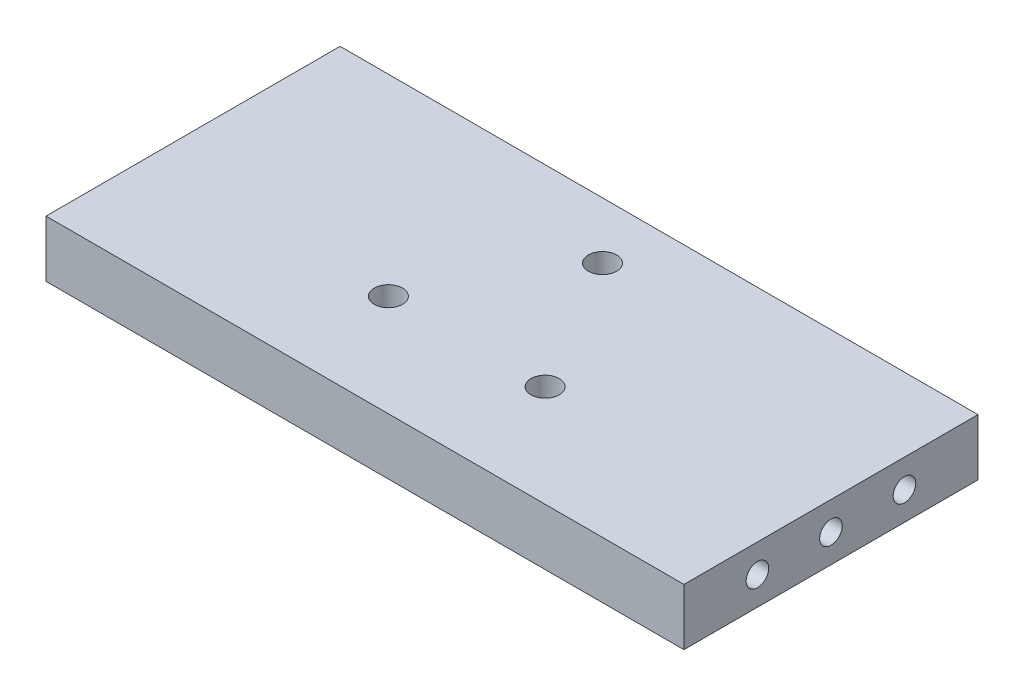
ISO-10303-21;
HEADER;
FILE_DESCRIPTION(('STEP AP214'),'2;1');
FILE_NAME('part.step','',(''),(''),'','','');
FILE_SCHEMA(('AUTOMOTIVE_DESIGN { 1 0 10303 214 1 1 1 1 }'));
ENDSEC;
DATA;
#1=APPLICATION_CONTEXT('core data for automotive mechanical design processes');
#2=APPLICATION_PROTOCOL_DEFINITION('international standard','automotive_design',2000,#1);
#3=PRODUCT_CONTEXT('',#1,'mechanical');
#4=PRODUCT('Part','Part','',(#3));
#5=PRODUCT_RELATED_PRODUCT_CATEGORY('part','',(#4));
#6=PRODUCT_DEFINITION_FORMATION('','',#4);
#7=PRODUCT_DEFINITION_CONTEXT('part definition',#1,'design');
#8=PRODUCT_DEFINITION('design','',#6,#7);
#9=PRODUCT_DEFINITION_SHAPE('','',#8);
#10=(LENGTH_UNIT() NAMED_UNIT(*) SI_UNIT(.MILLI.,.METRE.));
#11=(NAMED_UNIT(*) PLANE_ANGLE_UNIT() SI_UNIT($,.RADIAN.));
#12=(NAMED_UNIT(*) SI_UNIT($,.STERADIAN.) SOLID_ANGLE_UNIT());
#13=UNCERTAINTY_MEASURE_WITH_UNIT(LENGTH_MEASURE(1.E-05),#10,'distance_accuracy_value','');
#14=(GEOMETRIC_REPRESENTATION_CONTEXT(3) GLOBAL_UNCERTAINTY_ASSIGNED_CONTEXT((#13)) GLOBAL_UNIT_ASSIGNED_CONTEXT((#10,
#11,#12)) REPRESENTATION_CONTEXT('',''));
#15=CARTESIAN_POINT('',(0.,0.,0.));
#16=DIRECTION('',(0.,0.,1.));
#17=DIRECTION('',(1.,0.,0.));
#18=AXIS2_PLACEMENT_3D('',#15,#16,#17);
#19=CARTESIAN_POINT('',(0.,5.,0.));
#20=DIRECTION('',(1.,0.,0.));
#21=DIRECTION('',(0.,0.,-1.));
#22=AXIS2_PLACEMENT_3D('',#19,#20,#21);
#23=PLANE('',#22);
#24=CARTESIAN_POINT('',(0.,2.5,-19.5));
#25=DIRECTION('',(-1.,0.,0.));
#26=DIRECTION('',(0.,0.,1.));
#27=AXIS2_PLACEMENT_3D('',#24,#25,#26);
#28=CIRCLE('',#27,0.999999999999989);
#29=CARTESIAN_POINT('',(0.,2.5,-18.5));
#30=VERTEX_POINT('',#29);
#31=EDGE_CURVE('E139',#30,#30,#28,.T.);
#32=ORIENTED_EDGE('',*,*,#31,.F.);
#33=EDGE_LOOP('',(#32));
#34=FACE_BOUND('',#33,.T.);
#35=CARTESIAN_POINT('',(0.,2.5,-13.));
#36=DIRECTION('',(-1.,0.,0.));
#37=DIRECTION('',(0.,0.,1.));
#38=AXIS2_PLACEMENT_3D('',#35,#36,#37);
#39=CIRCLE('',#38,0.999999999999989);
#40=CARTESIAN_POINT('',(0.,2.5,-12.));
#41=VERTEX_POINT('',#40);
#42=EDGE_CURVE('E138',#41,#41,#39,.T.);
#43=ORIENTED_EDGE('',*,*,#42,.F.);
#44=EDGE_LOOP('',(#43));
#45=FACE_BOUND('',#44,.T.);
#46=CARTESIAN_POINT('',(0.,2.5,-6.5));
#47=DIRECTION('',(-1.,0.,0.));
#48=DIRECTION('',(0.,0.,1.));
#49=AXIS2_PLACEMENT_3D('',#46,#47,#48);
#50=CIRCLE('',#49,0.999999999999989);
#51=CARTESIAN_POINT('',(0.,2.5,-5.50000000000001));
#52=VERTEX_POINT('',#51);
#53=EDGE_CURVE('E154',#52,#52,#50,.T.);
#54=ORIENTED_EDGE('',*,*,#53,.F.);
#55=EDGE_LOOP('',(#54));
#56=FACE_BOUND('',#55,.T.);
#57=DIRECTION('',(0.,0.,1.));
#58=VECTOR('',#57,1.);
#59=CARTESIAN_POINT('',(0.,0.,0.));
#60=LINE('',#59,#58);
#61=CARTESIAN_POINT('',(0.,0.,-26.));
#62=VERTEX_POINT('',#61);
#63=CARTESIAN_POINT('',(0.,0.,0.));
#64=VERTEX_POINT('',#63);
#65=EDGE_CURVE('E186',#62,#64,#60,.T.);
#66=ORIENTED_EDGE('',*,*,#65,.T.);
#67=DIRECTION('',(0.,-1.,0.));
#68=VECTOR('',#67,1.);
#69=CARTESIAN_POINT('',(0.,5.,0.));
#70=LINE('',#69,#68);
#71=CARTESIAN_POINT('',(0.,5.,0.));
#72=VERTEX_POINT('',#71);
#73=EDGE_CURVE('E13',#72,#64,#70,.T.);
#74=ORIENTED_EDGE('',*,*,#73,.F.);
#75=DIRECTION('',(0.,0.,1.));
#76=VECTOR('',#75,1.);
#77=CARTESIAN_POINT('',(0.,5.,0.));
#78=LINE('',#77,#76);
#79=CARTESIAN_POINT('',(0.,5.,-26.));
#80=VERTEX_POINT('',#79);
#81=EDGE_CURVE('E187',#80,#72,#78,.T.);
#82=ORIENTED_EDGE('',*,*,#81,.F.);
#83=DIRECTION('',(0.,-1.,0.));
#84=VECTOR('',#83,1.);
#85=CARTESIAN_POINT('',(0.,5.,-26.));
#86=LINE('',#85,#84);
#87=EDGE_CURVE('E197',#80,#62,#86,.T.);
#88=ORIENTED_EDGE('',*,*,#87,.T.);
#89=EDGE_LOOP('',(#66,#74,#82,#88));
#90=FACE_BOUND('',#89,.T.);
#91=ADVANCED_FACE('F58',(#34,#45,#56,#90),#23,.F.);
#92=CARTESIAN_POINT('',(0.,5.,0.));
#93=DIRECTION('',(0.,0.,-1.));
#94=DIRECTION('',(-1.,0.,0.));
#95=AXIS2_PLACEMENT_3D('',#92,#93,#94);
#96=PLANE('',#95);
#97=DIRECTION('',(1.,0.,0.));
#98=VECTOR('',#97,1.);
#99=CARTESIAN_POINT('',(0.,0.,0.));
#100=LINE('',#99,#98);
#101=CARTESIAN_POINT('',(56.4,0.,0.));
#102=VERTEX_POINT('',#101);
#103=EDGE_CURVE('E201',#64,#102,#100,.T.);
#104=ORIENTED_EDGE('',*,*,#103,.T.);
#105=DIRECTION('',(0.,-1.,0.));
#106=VECTOR('',#105,1.);
#107=CARTESIAN_POINT('',(56.4,5.,0.));
#108=LINE('',#107,#106);
#109=CARTESIAN_POINT('',(56.4,5.,0.));
#110=VERTEX_POINT('',#109);
#111=EDGE_CURVE('E68',#110,#102,#108,.T.);
#112=ORIENTED_EDGE('',*,*,#111,.F.);
#113=DIRECTION('',(1.,0.,0.));
#114=VECTOR('',#113,1.);
#115=CARTESIAN_POINT('',(0.,5.,0.));
#116=LINE('',#115,#114);
#117=EDGE_CURVE('E108',#72,#110,#116,.T.);
#118=ORIENTED_EDGE('',*,*,#117,.F.);
#119=ORIENTED_EDGE('',*,*,#73,.T.);
#120=EDGE_LOOP('',(#104,#112,#118,#119));
#121=FACE_BOUND('',#120,.T.);
#122=ADVANCED_FACE('F254',(#121),#96,.F.);
#123=CARTESIAN_POINT('',(56.4,5.,0.));
#124=DIRECTION('',(-1.,0.,0.));
#125=DIRECTION('',(0.,0.,1.));
#126=AXIS2_PLACEMENT_3D('',#123,#124,#125);
#127=PLANE('',#126);
#128=CARTESIAN_POINT('',(56.4,2.5,-6.5));
#129=DIRECTION('',(1.,0.,0.));
#130=DIRECTION('',(0.,0.,-1.));
#131=AXIS2_PLACEMENT_3D('',#128,#129,#130);
#132=CIRCLE('',#131,0.999999999999989);
#133=CARTESIAN_POINT('',(56.4,2.5,-7.49999999999999));
#134=VERTEX_POINT('',#133);
#135=EDGE_CURVE('E162',#134,#134,#132,.T.);
#136=ORIENTED_EDGE('',*,*,#135,.F.);
#137=EDGE_LOOP('',(#136));
#138=FACE_BOUND('',#137,.T.);
#139=CARTESIAN_POINT('',(56.4,2.5,-13.));
#140=DIRECTION('',(1.,0.,0.));
#141=DIRECTION('',(0.,0.,-1.));
#142=AXIS2_PLACEMENT_3D('',#139,#140,#141);
#143=CIRCLE('',#142,0.999999999999989);
#144=CARTESIAN_POINT('',(56.4,2.5,-14.));
#145=VERTEX_POINT('',#144);
#146=EDGE_CURVE('E170',#145,#145,#143,.T.);
#147=ORIENTED_EDGE('',*,*,#146,.F.);
#148=EDGE_LOOP('',(#147));
#149=FACE_BOUND('',#148,.T.);
#150=CARTESIAN_POINT('',(56.4,2.5,-19.5));
#151=DIRECTION('',(1.,0.,0.));
#152=DIRECTION('',(0.,0.,-1.));
#153=AXIS2_PLACEMENT_3D('',#150,#151,#152);
#154=CIRCLE('',#153,0.999999999999989);
#155=CARTESIAN_POINT('',(56.4,2.5,-20.5));
#156=VERTEX_POINT('',#155);
#157=EDGE_CURVE('E178',#156,#156,#154,.T.);
#158=ORIENTED_EDGE('',*,*,#157,.F.);
#159=EDGE_LOOP('',(#158));
#160=FACE_BOUND('',#159,.T.);
#161=DIRECTION('',(0.,0.,-1.));
#162=VECTOR('',#161,1.);
#163=CARTESIAN_POINT('',(56.4,0.,0.));
#164=LINE('',#163,#162);
#165=CARTESIAN_POINT('',(56.4,0.,-26.));
#166=VERTEX_POINT('',#165);
#167=EDGE_CURVE('E95',#102,#166,#164,.T.);
#168=ORIENTED_EDGE('',*,*,#167,.T.);
#169=DIRECTION('',(0.,-1.,0.));
#170=VECTOR('',#169,1.);
#171=CARTESIAN_POINT('',(56.4,5.,-26.));
#172=LINE('',#171,#170);
#173=CARTESIAN_POINT('',(56.4,5.,-26.));
#174=VERTEX_POINT('',#173);
#175=EDGE_CURVE('E210',#174,#166,#172,.T.);
#176=ORIENTED_EDGE('',*,*,#175,.F.);
#177=DIRECTION('',(0.,0.,-1.));
#178=VECTOR('',#177,1.);
#179=CARTESIAN_POINT('',(56.4,5.,0.));
#180=LINE('',#179,#178);
#181=EDGE_CURVE('E192',#110,#174,#180,.T.);
#182=ORIENTED_EDGE('',*,*,#181,.F.);
#183=ORIENTED_EDGE('',*,*,#111,.T.);
#184=EDGE_LOOP('',(#168,#176,#182,#183));
#185=FACE_BOUND('',#184,.T.);
#186=ADVANCED_FACE('F253',(#138,#149,#160,#185),#127,.F.);
#187=CARTESIAN_POINT('',(0.,5.,-26.));
#188=DIRECTION('',(0.,0.,1.));
#189=DIRECTION('',(1.,0.,0.));
#190=AXIS2_PLACEMENT_3D('',#187,#188,#189);
#191=PLANE('',#190);
#192=DIRECTION('',(-1.,0.,0.));
#193=VECTOR('',#192,1.);
#194=CARTESIAN_POINT('',(0.,0.,-26.));
#195=LINE('',#194,#193);
#196=EDGE_CURVE('E101',#166,#62,#195,.T.);
#197=ORIENTED_EDGE('',*,*,#196,.T.);
#198=ORIENTED_EDGE('',*,*,#87,.F.);
#199=DIRECTION('',(-1.,0.,0.));
#200=VECTOR('',#199,1.);
#201=CARTESIAN_POINT('',(0.,5.,-26.));
#202=LINE('',#201,#200);
#203=EDGE_CURVE('E77',#174,#80,#202,.T.);
#204=ORIENTED_EDGE('',*,*,#203,.F.);
#205=ORIENTED_EDGE('',*,*,#175,.T.);
#206=EDGE_LOOP('',(#197,#198,#204,#205));
#207=FACE_BOUND('',#206,.T.);
#208=ADVANCED_FACE('F251',(#207),#191,.F.);
#209=CARTESIAN_POINT('',(0.,5.,0.));
#210=DIRECTION('',(0.,-1.,0.));
#211=DIRECTION('',(0.,0.,-1.));
#212=AXIS2_PLACEMENT_3D('',#209,#210,#211);
#213=PLANE('',#212);
#214=CARTESIAN_POINT('',(21.2717967697245,5.,-9.));
#215=DIRECTION('',(0.,1.,0.));
#216=DIRECTION('',(0.,0.,1.));
#217=AXIS2_PLACEMENT_3D('',#214,#215,#216);
#218=CIRCLE('',#217,1.25);
#219=CARTESIAN_POINT('',(21.2717967697245,5.,-7.75));
#220=VERTEX_POINT('',#219);
#221=EDGE_CURVE('E231',#220,#220,#218,.T.);
#222=ORIENTED_EDGE('',*,*,#221,.F.);
#223=EDGE_LOOP('',(#222));
#224=FACE_BOUND('',#223,.T.);
#225=CARTESIAN_POINT('',(28.2,5.,-21.));
#226=DIRECTION('',(0.,1.,0.));
#227=DIRECTION('',(0.,0.,1.));
#228=AXIS2_PLACEMENT_3D('',#225,#226,#227);
#229=CIRCLE('',#228,1.25);
#230=CARTESIAN_POINT('',(28.2,5.,-19.75));
#231=VERTEX_POINT('',#230);
#232=EDGE_CURVE('E218',#231,#231,#229,.T.);
#233=ORIENTED_EDGE('',*,*,#232,.F.);
#234=EDGE_LOOP('',(#233));
#235=FACE_BOUND('',#234,.T.);
#236=CARTESIAN_POINT('',(35.1282032302755,5.,-9.));
#237=DIRECTION('',(0.,1.,0.));
#238=DIRECTION('',(0.,0.,1.));
#239=AXIS2_PLACEMENT_3D('',#236,#237,#238);
#240=CIRCLE('',#239,1.25);
#241=CARTESIAN_POINT('',(35.1282032302755,5.,-7.75));
#242=VERTEX_POINT('',#241);
#243=EDGE_CURVE('E217',#242,#242,#240,.T.);
#244=ORIENTED_EDGE('',*,*,#243,.F.);
#245=EDGE_LOOP('',(#244));
#246=FACE_BOUND('',#245,.T.);
#247=ORIENTED_EDGE('',*,*,#81,.T.);
#248=ORIENTED_EDGE('',*,*,#117,.T.);
#249=ORIENTED_EDGE('',*,*,#181,.T.);
#250=ORIENTED_EDGE('',*,*,#203,.T.);
#251=EDGE_LOOP('',(#247,#248,#249,#250));
#252=FACE_BOUND('',#251,.T.);
#253=ADVANCED_FACE('F244',(#224,#235,#246,#252),#213,.F.);
#254=CARTESIAN_POINT('',(0.,0.,0.));
#255=DIRECTION('',(0.,-1.,0.));
#256=DIRECTION('',(0.,0.,-1.));
#257=AXIS2_PLACEMENT_3D('',#254,#255,#256);
#258=PLANE('',#257);
#259=CARTESIAN_POINT('',(21.2717967697245,0.,-9.));
#260=DIRECTION('',(0.,-1.,0.));
#261=DIRECTION('',(0.,0.,-1.));
#262=AXIS2_PLACEMENT_3D('',#259,#260,#261);
#263=CIRCLE('',#262,1.25);
#264=CARTESIAN_POINT('',(21.2717967697245,0.,-10.25));
#265=VERTEX_POINT('',#264);
#266=EDGE_CURVE('E61',#265,#265,#263,.T.);
#267=ORIENTED_EDGE('',*,*,#266,.F.);
#268=EDGE_LOOP('',(#267));
#269=FACE_BOUND('',#268,.T.);
#270=CARTESIAN_POINT('',(28.2,0.,-21.));
#271=DIRECTION('',(0.,-1.,0.));
#272=DIRECTION('',(0.,0.,-1.));
#273=AXIS2_PLACEMENT_3D('',#270,#271,#272);
#274=CIRCLE('',#273,1.25);
#275=CARTESIAN_POINT('',(28.2,0.,-22.25));
#276=VERTEX_POINT('',#275);
#277=EDGE_CURVE('E214',#276,#276,#274,.T.);
#278=ORIENTED_EDGE('',*,*,#277,.F.);
#279=EDGE_LOOP('',(#278));
#280=FACE_BOUND('',#279,.T.);
#281=CARTESIAN_POINT('',(35.1282032302755,0.,-9.));
#282=DIRECTION('',(0.,-1.,0.));
#283=DIRECTION('',(0.,0.,-1.));
#284=AXIS2_PLACEMENT_3D('',#281,#282,#283);
#285=CIRCLE('',#284,1.25);
#286=CARTESIAN_POINT('',(35.1282032302755,0.,-10.25));
#287=VERTEX_POINT('',#286);
#288=EDGE_CURVE('E147',#287,#287,#285,.T.);
#289=ORIENTED_EDGE('',*,*,#288,.F.);
#290=EDGE_LOOP('',(#289));
#291=FACE_BOUND('',#290,.T.);
#292=ORIENTED_EDGE('',*,*,#65,.F.);
#293=ORIENTED_EDGE('',*,*,#196,.F.);
#294=ORIENTED_EDGE('',*,*,#167,.F.);
#295=ORIENTED_EDGE('',*,*,#103,.F.);
#296=EDGE_LOOP('',(#292,#293,#294,#295));
#297=FACE_BOUND('',#296,.T.);
#298=ADVANCED_FACE('F240',(#269,#280,#291,#297),#258,.T.);
#299=CARTESIAN_POINT('',(49.4,2.5,-19.5));
#300=DIRECTION('',(1.,0.,0.));
#301=DIRECTION('',(0.,0.,-1.));
#302=AXIS2_PLACEMENT_3D('',#299,#300,#301);
#303=CONICAL_SURFACE('',#302,0.999999999999987,1.02974425867664);
#304=CARTESIAN_POINT('',(48.7991393809724,2.5,-19.5));
#305=VERTEX_POINT('',#304);
#306=VERTEX_LOOP('',#305);
#307=FACE_BOUND('',#306,.T.);
#308=CARTESIAN_POINT('',(49.4,2.5,-19.5));
#309=DIRECTION('',(1.,0.,0.));
#310=DIRECTION('',(0.,0.,-1.));
#311=AXIS2_PLACEMENT_3D('',#308,#309,#310);
#312=CIRCLE('',#311,0.999999999999987);
#313=CARTESIAN_POINT('',(49.4,2.5,-20.5));
#314=VERTEX_POINT('',#313);
#315=EDGE_CURVE('E182',#314,#314,#312,.T.);
#316=ORIENTED_EDGE('',*,*,#315,.T.);
#317=EDGE_LOOP('',(#316));
#318=FACE_BOUND('',#317,.T.);
#319=ADVANCED_FACE('F243',(#307,#318),#303,.F.);
#320=CARTESIAN_POINT('',(56.4,2.5,-19.5));
#321=DIRECTION('',(1.,0.,0.));
#322=DIRECTION('',(0.,0.,-1.));
#323=AXIS2_PLACEMENT_3D('',#320,#321,#322);
#324=CYLINDRICAL_SURFACE('',#323,0.999999999999988);
#325=ORIENTED_EDGE('',*,*,#315,.F.);
#326=EDGE_LOOP('',(#325));
#327=FACE_BOUND('',#326,.T.);
#328=ORIENTED_EDGE('',*,*,#157,.T.);
#329=EDGE_LOOP('',(#328));
#330=FACE_BOUND('',#329,.T.);
#331=ADVANCED_FACE('F271',(#327,#330),#324,.F.);
#332=CARTESIAN_POINT('',(49.4,2.5,-13.));
#333=DIRECTION('',(1.,0.,0.));
#334=DIRECTION('',(0.,0.,-1.));
#335=AXIS2_PLACEMENT_3D('',#332,#333,#334);
#336=CONICAL_SURFACE('',#335,0.999999999999987,1.02974425867664);
#337=CARTESIAN_POINT('',(48.7991393809724,2.5,-13.));
#338=VERTEX_POINT('',#337);
#339=VERTEX_LOOP('',#338);
#340=FACE_BOUND('',#339,.T.);
#341=CARTESIAN_POINT('',(49.4,2.5,-13.));
#342=DIRECTION('',(1.,0.,0.));
#343=DIRECTION('',(0.,0.,-1.));
#344=AXIS2_PLACEMENT_3D('',#341,#342,#343);
#345=CIRCLE('',#344,0.999999999999987);
#346=CARTESIAN_POINT('',(49.4,2.5,-14.));
#347=VERTEX_POINT('',#346);
#348=EDGE_CURVE('E174',#347,#347,#345,.T.);
#349=ORIENTED_EDGE('',*,*,#348,.T.);
#350=EDGE_LOOP('',(#349));
#351=FACE_BOUND('',#350,.T.);
#352=ADVANCED_FACE('F275',(#340,#351),#336,.F.);
#353=CARTESIAN_POINT('',(56.4,2.5,-13.));
#354=DIRECTION('',(1.,0.,0.));
#355=DIRECTION('',(0.,0.,-1.));
#356=AXIS2_PLACEMENT_3D('',#353,#354,#355);
#357=CYLINDRICAL_SURFACE('',#356,0.999999999999988);
#358=ORIENTED_EDGE('',*,*,#348,.F.);
#359=EDGE_LOOP('',(#358));
#360=FACE_BOUND('',#359,.T.);
#361=ORIENTED_EDGE('',*,*,#146,.T.);
#362=EDGE_LOOP('',(#361));
#363=FACE_BOUND('',#362,.T.);
#364=ADVANCED_FACE('F279',(#360,#363),#357,.F.);
#365=CARTESIAN_POINT('',(49.4,2.5,-6.5));
#366=DIRECTION('',(1.,0.,0.));
#367=DIRECTION('',(0.,0.,-1.));
#368=AXIS2_PLACEMENT_3D('',#365,#366,#367);
#369=CONICAL_SURFACE('',#368,0.999999999999987,1.02974425867664);
#370=CARTESIAN_POINT('',(48.7991393809724,2.5,-6.5));
#371=VERTEX_POINT('',#370);
#372=VERTEX_LOOP('',#371);
#373=FACE_BOUND('',#372,.T.);
#374=CARTESIAN_POINT('',(49.4,2.5,-6.5));
#375=DIRECTION('',(1.,0.,0.));
#376=DIRECTION('',(0.,0.,-1.));
#377=AXIS2_PLACEMENT_3D('',#374,#375,#376);
#378=CIRCLE('',#377,0.999999999999987);
#379=CARTESIAN_POINT('',(49.4,2.5,-7.49999999999999));
#380=VERTEX_POINT('',#379);
#381=EDGE_CURVE('E166',#380,#380,#378,.T.);
#382=ORIENTED_EDGE('',*,*,#381,.T.);
#383=EDGE_LOOP('',(#382));
#384=FACE_BOUND('',#383,.T.);
#385=ADVANCED_FACE('F283',(#373,#384),#369,.F.);
#386=CARTESIAN_POINT('',(56.4,2.5,-6.5));
#387=DIRECTION('',(1.,0.,0.));
#388=DIRECTION('',(0.,0.,-1.));
#389=AXIS2_PLACEMENT_3D('',#386,#387,#388);
#390=CYLINDRICAL_SURFACE('',#389,0.999999999999988);
#391=ORIENTED_EDGE('',*,*,#381,.F.);
#392=EDGE_LOOP('',(#391));
#393=FACE_BOUND('',#392,.T.);
#394=ORIENTED_EDGE('',*,*,#135,.T.);
#395=EDGE_LOOP('',(#394));
#396=FACE_BOUND('',#395,.T.);
#397=ADVANCED_FACE('F287',(#393,#396),#390,.F.);
#398=CARTESIAN_POINT('',(6.99999999999999,2.5,-6.5));
#399=DIRECTION('',(-1.,0.,0.));
#400=DIRECTION('',(0.,0.,1.));
#401=AXIS2_PLACEMENT_3D('',#398,#399,#400);
#402=CONICAL_SURFACE('',#401,0.999999999999987,1.02974425867664);
#403=CARTESIAN_POINT('',(7.60086061902756,2.5,-6.5));
#404=VERTEX_POINT('',#403);
#405=VERTEX_LOOP('',#404);
#406=FACE_BOUND('',#405,.T.);
#407=CARTESIAN_POINT('',(6.99999999999999,2.5,-6.5));
#408=DIRECTION('',(-1.,0.,0.));
#409=DIRECTION('',(0.,0.,1.));
#410=AXIS2_PLACEMENT_3D('',#407,#408,#409);
#411=CIRCLE('',#410,0.999999999999987);
#412=CARTESIAN_POINT('',(6.99999999999999,2.5,-5.50000000000001));
#413=VERTEX_POINT('',#412);
#414=EDGE_CURVE('E158',#413,#413,#411,.T.);
#415=ORIENTED_EDGE('',*,*,#414,.T.);
#416=EDGE_LOOP('',(#415));
#417=FACE_BOUND('',#416,.T.);
#418=ADVANCED_FACE('F291',(#406,#417),#402,.F.);
#419=CARTESIAN_POINT('',(0.,2.5,-6.5));
#420=DIRECTION('',(-1.,0.,0.));
#421=DIRECTION('',(0.,0.,1.));
#422=AXIS2_PLACEMENT_3D('',#419,#420,#421);
#423=CYLINDRICAL_SURFACE('',#422,0.999999999999988);
#424=ORIENTED_EDGE('',*,*,#414,.F.);
#425=EDGE_LOOP('',(#424));
#426=FACE_BOUND('',#425,.T.);
#427=ORIENTED_EDGE('',*,*,#53,.T.);
#428=EDGE_LOOP('',(#427));
#429=FACE_BOUND('',#428,.T.);
#430=ADVANCED_FACE('F295',(#426,#429),#423,.F.);
#431=CARTESIAN_POINT('',(6.99999999999999,2.5,-13.));
#432=DIRECTION('',(-1.,0.,0.));
#433=DIRECTION('',(0.,0.,1.));
#434=AXIS2_PLACEMENT_3D('',#431,#432,#433);
#435=CONICAL_SURFACE('',#434,0.999999999999987,1.02974425867664);
#436=CARTESIAN_POINT('',(7.60086061902756,2.5,-13.));
#437=VERTEX_POINT('',#436);
#438=VERTEX_LOOP('',#437);
#439=FACE_BOUND('',#438,.T.);
#440=CARTESIAN_POINT('',(6.99999999999999,2.5,-13.));
#441=DIRECTION('',(-1.,0.,0.));
#442=DIRECTION('',(0.,0.,1.));
#443=AXIS2_PLACEMENT_3D('',#440,#441,#442);
#444=CIRCLE('',#443,0.999999999999987);
#445=CARTESIAN_POINT('',(6.99999999999999,2.5,-12.));
#446=VERTEX_POINT('',#445);
#447=EDGE_CURVE('E144',#446,#446,#444,.T.);
#448=ORIENTED_EDGE('',*,*,#447,.T.);
#449=EDGE_LOOP('',(#448));
#450=FACE_BOUND('',#449,.T.);
#451=ADVANCED_FACE('F299',(#439,#450),#435,.F.);
#452=CARTESIAN_POINT('',(0.,2.5,-13.));
#453=DIRECTION('',(-1.,0.,0.));
#454=DIRECTION('',(0.,0.,1.));
#455=AXIS2_PLACEMENT_3D('',#452,#453,#454);
#456=CYLINDRICAL_SURFACE('',#455,0.999999999999988);
#457=ORIENTED_EDGE('',*,*,#447,.F.);
#458=EDGE_LOOP('',(#457));
#459=FACE_BOUND('',#458,.T.);
#460=ORIENTED_EDGE('',*,*,#42,.T.);
#461=EDGE_LOOP('',(#460));
#462=FACE_BOUND('',#461,.T.);
#463=ADVANCED_FACE('F131',(#459,#462),#456,.F.);
#464=CARTESIAN_POINT('',(6.99999999999999,2.5,-19.5));
#465=DIRECTION('',(-1.,0.,0.));
#466=DIRECTION('',(0.,0.,1.));
#467=AXIS2_PLACEMENT_3D('',#464,#465,#466);
#468=CONICAL_SURFACE('',#467,0.999999999999987,1.02974425867664);
#469=CARTESIAN_POINT('',(7.60086061902756,2.5,-19.5));
#470=VERTEX_POINT('',#469);
#471=VERTEX_LOOP('',#470);
#472=FACE_BOUND('',#471,.T.);
#473=CARTESIAN_POINT('',(6.99999999999999,2.5,-19.5));
#474=DIRECTION('',(-1.,0.,0.));
#475=DIRECTION('',(0.,0.,1.));
#476=AXIS2_PLACEMENT_3D('',#473,#474,#475);
#477=CIRCLE('',#476,0.999999999999987);
#478=CARTESIAN_POINT('',(6.99999999999999,2.5,-18.5));
#479=VERTEX_POINT('',#478);
#480=EDGE_CURVE('E135',#479,#479,#477,.T.);
#481=ORIENTED_EDGE('',*,*,#480,.T.);
#482=EDGE_LOOP('',(#481));
#483=FACE_BOUND('',#482,.T.);
#484=ADVANCED_FACE('F127',(#472,#483),#468,.F.);
#485=CARTESIAN_POINT('',(0.,2.5,-19.5));
#486=DIRECTION('',(-1.,0.,0.));
#487=DIRECTION('',(0.,0.,1.));
#488=AXIS2_PLACEMENT_3D('',#485,#486,#487);
#489=CYLINDRICAL_SURFACE('',#488,0.999999999999988);
#490=ORIENTED_EDGE('',*,*,#480,.F.);
#491=EDGE_LOOP('',(#490));
#492=FACE_BOUND('',#491,.T.);
#493=ORIENTED_EDGE('',*,*,#31,.T.);
#494=EDGE_LOOP('',(#493));
#495=FACE_BOUND('',#494,.T.);
#496=ADVANCED_FACE('F130',(#492,#495),#489,.F.);
#497=CARTESIAN_POINT('',(35.1282032302755,5.,-9.));
#498=DIRECTION('',(0.,1.,0.));
#499=DIRECTION('',(0.,0.,1.));
#500=AXIS2_PLACEMENT_3D('',#497,#498,#499);
#501=CYLINDRICAL_SURFACE('',#500,1.25);
#502=ORIENTED_EDGE('',*,*,#288,.T.);
#503=EDGE_LOOP('',(#502));
#504=FACE_BOUND('',#503,.T.);
#505=ORIENTED_EDGE('',*,*,#243,.T.);
#506=EDGE_LOOP('',(#505));
#507=FACE_BOUND('',#506,.T.);
#508=ADVANCED_FACE('F237',(#504,#507),#501,.F.);
#509=CARTESIAN_POINT('',(28.2,5.,-21.));
#510=DIRECTION('',(0.,1.,0.));
#511=DIRECTION('',(0.,0.,1.));
#512=AXIS2_PLACEMENT_3D('',#509,#510,#511);
#513=CYLINDRICAL_SURFACE('',#512,1.25);
#514=ORIENTED_EDGE('',*,*,#277,.T.);
#515=EDGE_LOOP('',(#514));
#516=FACE_BOUND('',#515,.T.);
#517=ORIENTED_EDGE('',*,*,#232,.T.);
#518=EDGE_LOOP('',(#517));
#519=FACE_BOUND('',#518,.T.);
#520=ADVANCED_FACE('F311',(#516,#519),#513,.F.);
#521=CARTESIAN_POINT('',(21.2717967697245,5.,-9.));
#522=DIRECTION('',(0.,1.,0.));
#523=DIRECTION('',(0.,0.,1.));
#524=AXIS2_PLACEMENT_3D('',#521,#522,#523);
#525=CYLINDRICAL_SURFACE('',#524,1.25);
#526=ORIENTED_EDGE('',*,*,#266,.T.);
#527=EDGE_LOOP('',(#526));
#528=FACE_BOUND('',#527,.T.);
#529=ORIENTED_EDGE('',*,*,#221,.T.);
#530=EDGE_LOOP('',(#529));
#531=FACE_BOUND('',#530,.T.);
#532=ADVANCED_FACE('F314',(#528,#531),#525,.F.);
#533=CLOSED_SHELL('',(#91,#122,#186,#208,#253,#298,#319,#331,#352,#364,#385,#397,#418,#430,#451,
#463,#484,#496,#508,#520,#532));
#534=MANIFOLD_SOLID_BREP('B2',#533);
#535=ADVANCED_BREP_SHAPE_REPRESENTATION('',(#18,#534),#14);
#536=SHAPE_DEFINITION_REPRESENTATION(#9,#535);
ENDSEC;
END-ISO-10303-21;
